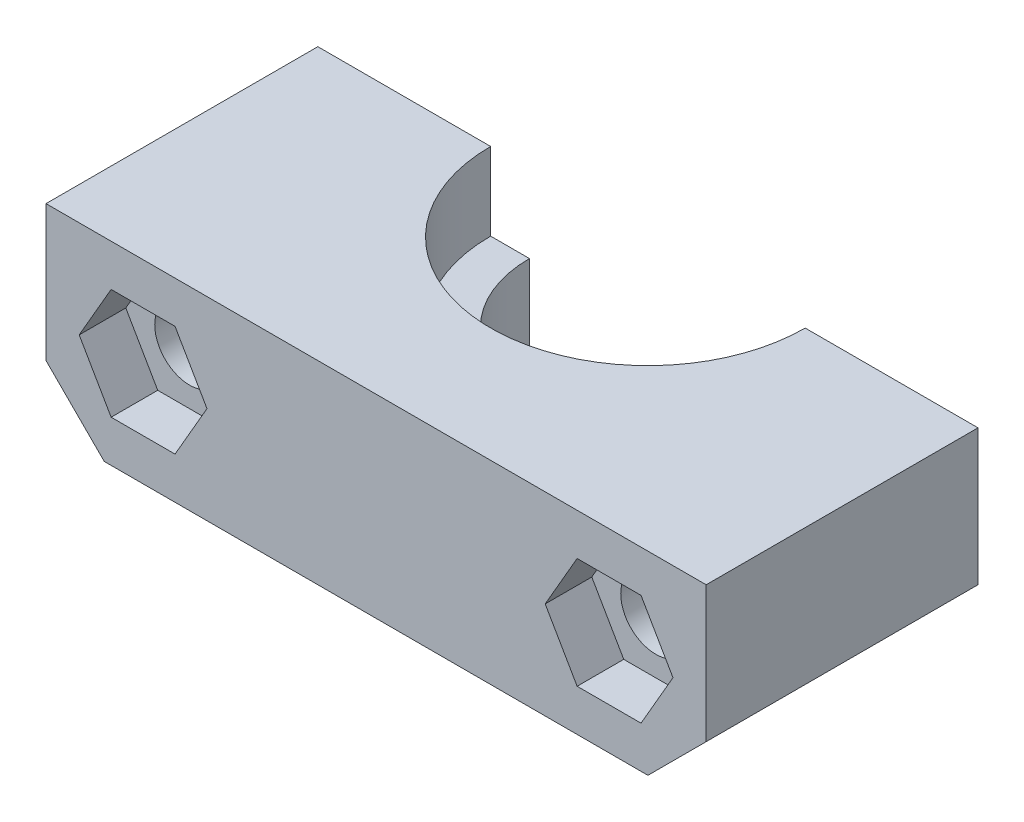
ISO-10303-21;
HEADER;
FILE_DESCRIPTION(('STEP AP214'),'2;1');
FILE_NAME('part.step','',(''),(''),'','','');
FILE_SCHEMA(('AUTOMOTIVE_DESIGN { 1 0 10303 214 1 1 1 1 }'));
ENDSEC;
DATA;
#1=APPLICATION_CONTEXT('core data for automotive mechanical design processes');
#2=APPLICATION_PROTOCOL_DEFINITION('international standard','automotive_design',2000,#1);
#3=PRODUCT_CONTEXT('',#1,'mechanical');
#4=PRODUCT('Part','Part','',(#3));
#5=PRODUCT_RELATED_PRODUCT_CATEGORY('part','',(#4));
#6=PRODUCT_DEFINITION_FORMATION('','',#4);
#7=PRODUCT_DEFINITION_CONTEXT('part definition',#1,'design');
#8=PRODUCT_DEFINITION('design','',#6,#7);
#9=PRODUCT_DEFINITION_SHAPE('','',#8);
#10=(LENGTH_UNIT() NAMED_UNIT(*) SI_UNIT(.MILLI.,.METRE.));
#11=(NAMED_UNIT(*) PLANE_ANGLE_UNIT() SI_UNIT($,.RADIAN.));
#12=(NAMED_UNIT(*) SI_UNIT($,.STERADIAN.) SOLID_ANGLE_UNIT());
#13=UNCERTAINTY_MEASURE_WITH_UNIT(LENGTH_MEASURE(1.E-05),#10,'distance_accuracy_value','');
#14=(GEOMETRIC_REPRESENTATION_CONTEXT(3) GLOBAL_UNCERTAINTY_ASSIGNED_CONTEXT((#13)) GLOBAL_UNIT_ASSIGNED_CONTEXT((#10,
#11,#12)) REPRESENTATION_CONTEXT('',''));
#15=CARTESIAN_POINT('',(0.,0.,0.));
#16=DIRECTION('',(0.,0.,1.));
#17=DIRECTION('',(1.,0.,0.));
#18=AXIS2_PLACEMENT_3D('',#15,#16,#17);
#19=CARTESIAN_POINT('',(29.,5.,0.));
#20=DIRECTION('',(0.,0.,-1.));
#21=DIRECTION('',(-1.,0.,0.));
#22=AXIS2_PLACEMENT_3D('',#19,#20,#21);
#23=CYLINDRICAL_SURFACE('',#22,1.8);
#24=CARTESIAN_POINT('',(29.,5.,-14.));
#25=DIRECTION('',(0.,0.,1.));
#26=DIRECTION('',(1.,0.,0.));
#27=AXIS2_PLACEMENT_3D('',#24,#25,#26);
#28=CIRCLE('',#27,1.8);
#29=CARTESIAN_POINT('',(27.2,5.,-14.));
#30=VERTEX_POINT('',#29);
#31=EDGE_CURVE('E291',#30,#30,#28,.T.);
#32=CARTESIAN_POINT('',(29.,5.,-2.4));
#33=DIRECTION('',(0.,0.,1.));
#34=DIRECTION('',(1.,0.,0.));
#35=AXIS2_PLACEMENT_3D('',#32,#33,#34);
#36=CIRCLE('',#35,1.8);
#37=CARTESIAN_POINT('',(27.2,5.,-2.4));
#38=VERTEX_POINT('',#37);
#39=EDGE_CURVE('E234',#38,#38,#36,.F.);
#40=CARTESIAN_POINT('',(27.2,5.,-14.));
#41=CARTESIAN_POINT('',(27.2,5.,-13.8791666666667));
#42=CARTESIAN_POINT('',(27.2,5.,-13.7583333333333));
#43=CARTESIAN_POINT('',(27.2,5.,-13.5166666666667));
#44=CARTESIAN_POINT('',(27.2,5.,-13.3958333333333));
#45=CARTESIAN_POINT('',(27.2,5.,-13.1541666666667));
#46=CARTESIAN_POINT('',(27.2,5.,-13.0333333333333));
#47=CARTESIAN_POINT('',(27.2,5.,-12.7916666666667));
#48=CARTESIAN_POINT('',(27.2,5.,-12.6708333333333));
#49=CARTESIAN_POINT('',(27.2,5.,-12.4291666666667));
#50=CARTESIAN_POINT('',(27.2,5.,-12.3083333333333));
#51=CARTESIAN_POINT('',(27.2,5.,-12.0666666666667));
#52=CARTESIAN_POINT('',(27.2,5.,-11.9458333333333));
#53=CARTESIAN_POINT('',(27.2,5.,-11.7041666666667));
#54=CARTESIAN_POINT('',(27.2,5.,-11.5833333333333));
#55=CARTESIAN_POINT('',(27.2,5.,-11.3416666666667));
#56=CARTESIAN_POINT('',(27.2,5.,-11.2208333333333));
#57=CARTESIAN_POINT('',(27.2,5.,-10.9791666666667));
#58=CARTESIAN_POINT('',(27.2,5.,-10.8583333333333));
#59=CARTESIAN_POINT('',(27.2,5.,-10.6166666666667));
#60=CARTESIAN_POINT('',(27.2,5.,-10.4958333333333));
#61=CARTESIAN_POINT('',(27.2,5.,-10.2541666666667));
#62=CARTESIAN_POINT('',(27.2,5.,-10.1333333333333));
#63=CARTESIAN_POINT('',(27.2,5.,-9.89166666666667));
#64=CARTESIAN_POINT('',(27.2,5.,-9.77083333333333));
#65=CARTESIAN_POINT('',(27.2,5.,-9.52916666666667));
#66=CARTESIAN_POINT('',(27.2,5.,-9.40833333333333));
#67=CARTESIAN_POINT('',(27.2,5.,-9.16666666666666));
#68=CARTESIAN_POINT('',(27.2,5.,-9.04583333333333));
#69=CARTESIAN_POINT('',(27.2,5.,-8.80416666666667));
#70=CARTESIAN_POINT('',(27.2,5.,-8.68333333333333));
#71=CARTESIAN_POINT('',(27.2,5.,-8.44166666666666));
#72=CARTESIAN_POINT('',(27.2,5.,-8.32083333333333));
#73=CARTESIAN_POINT('',(27.2,5.,-8.07916666666667));
#74=CARTESIAN_POINT('',(27.2,5.,-7.95833333333333));
#75=CARTESIAN_POINT('',(27.2,5.,-7.71666666666667));
#76=CARTESIAN_POINT('',(27.2,5.,-7.59583333333333));
#77=CARTESIAN_POINT('',(27.2,5.,-7.35416666666667));
#78=CARTESIAN_POINT('',(27.2,5.,-7.23333333333333));
#79=CARTESIAN_POINT('',(27.2,5.,-6.99166666666667));
#80=CARTESIAN_POINT('',(27.2,5.,-6.87083333333333));
#81=CARTESIAN_POINT('',(27.2,5.,-6.62916666666667));
#82=CARTESIAN_POINT('',(27.2,5.,-6.50833333333333));
#83=CARTESIAN_POINT('',(27.2,5.,-6.26666666666667));
#84=CARTESIAN_POINT('',(27.2,5.,-6.14583333333333));
#85=CARTESIAN_POINT('',(27.2,5.,-5.90416666666667));
#86=CARTESIAN_POINT('',(27.2,5.,-5.78333333333333));
#87=CARTESIAN_POINT('',(27.2,5.,-5.54166666666667));
#88=CARTESIAN_POINT('',(27.2,5.,-5.42083333333333));
#89=CARTESIAN_POINT('',(27.2,5.,-5.17916666666667));
#90=CARTESIAN_POINT('',(27.2,5.,-5.05833333333333));
#91=CARTESIAN_POINT('',(27.2,5.,-4.81666666666667));
#92=CARTESIAN_POINT('',(27.2,5.,-4.69583333333333));
#93=CARTESIAN_POINT('',(27.2,5.,-4.45416666666667));
#94=CARTESIAN_POINT('',(27.2,5.,-4.33333333333333));
#95=CARTESIAN_POINT('',(27.2,5.,-4.09166666666667));
#96=CARTESIAN_POINT('',(27.2,5.,-3.97083333333333));
#97=CARTESIAN_POINT('',(27.2,5.,-3.72916666666667));
#98=CARTESIAN_POINT('',(27.2,5.,-3.60833333333333));
#99=CARTESIAN_POINT('',(27.2,5.,-3.36666666666667));
#100=CARTESIAN_POINT('',(27.2,5.,-3.24583333333333));
#101=CARTESIAN_POINT('',(27.2,5.,-3.00416666666667));
#102=CARTESIAN_POINT('',(27.2,5.,-2.88333333333333));
#103=CARTESIAN_POINT('',(27.2,5.,-2.64166666666667));
#104=CARTESIAN_POINT('',(27.2,5.,-2.52083333333333));
#105=CARTESIAN_POINT('',(27.2,5.,-2.4));
#106=B_SPLINE_CURVE_WITH_KNOTS('',3,(#40,#41,#42,#43,#44,#45,#46,#47,#48,#49,#50,#51,#52,#53,
#54,#55,#56,#57,#58,#59,#60,#61,#62,#63,#64,#65,#66,#67,#68,#69,#70,#71,#72,#73,#74,#75,#76,#77,
#78,#79,#80,#81,#82,#83,#84,#85,#86,#87,#88,#89,#90,#91,#92,#93,#94,#95,#96,#97,#98,#99,#100,
#101,#102,#103,#104,#105),.UNSPECIFIED.,.F.,.F.,(4,2,2,2,2,2,2,2,2,2,2,2,2,2,2,2,2,2,2,2,2,2,2,
2,2,2,2,2,2,2,2,2,4),(0.,0.3625,0.725,1.0875,1.45,1.8125,2.175,2.5375,2.9,3.2625,3.625,3.9875,
4.35,4.7125,5.075,5.4375,5.8,6.1625,6.525,6.8875,7.25,7.6125,7.975,8.3375,8.7,9.0625,9.425,
9.7875,10.15,10.5125,10.875,11.2375,11.6),.UNSPECIFIED.);
#107=EDGE_CURVE('BSEAM32',#30,#38,#106,.T.);
#108=ORIENTED_EDGE('',*,*,#31,.F.);
#109=ORIENTED_EDGE('',*,*,#39,.F.);
#110=ORIENTED_EDGE('',*,*,#107,.T.);
#111=ORIENTED_EDGE('',*,*,#107,.F.);
#112=EDGE_LOOP('',(#108,#110,#109,#111));
#113=FACE_BOUND('',#112,.T.);
#114=ADVANCED_FACE('F32',(#113),#23,.F.);
#115=CARTESIAN_POINT('',(5.,5.,0.));
#116=DIRECTION('',(0.,0.,-1.));
#117=DIRECTION('',(-1.,0.,0.));
#118=AXIS2_PLACEMENT_3D('',#115,#116,#117);
#119=CYLINDRICAL_SURFACE('',#118,1.8);
#120=CARTESIAN_POINT('',(5.,5.,-14.));
#121=DIRECTION('',(0.,0.,1.));
#122=DIRECTION('',(1.,0.,0.));
#123=AXIS2_PLACEMENT_3D('',#120,#121,#122);
#124=CIRCLE('',#123,1.8);
#125=CARTESIAN_POINT('',(3.2,5.,-14.));
#126=VERTEX_POINT('',#125);
#127=EDGE_CURVE('E295',#126,#126,#124,.T.);
#128=CARTESIAN_POINT('',(5.,5.,-2.4));
#129=DIRECTION('',(0.,0.,1.));
#130=DIRECTION('',(1.,0.,0.));
#131=AXIS2_PLACEMENT_3D('',#128,#129,#130);
#132=CIRCLE('',#131,1.8);
#133=CARTESIAN_POINT('',(3.2,5.,-2.4));
#134=VERTEX_POINT('',#133);
#135=EDGE_CURVE('E280',#134,#134,#132,.F.);
#136=CARTESIAN_POINT('',(3.2,5.,-14.));
#137=CARTESIAN_POINT('',(3.2,5.,-13.8791666666667));
#138=CARTESIAN_POINT('',(3.2,5.,-13.7583333333333));
#139=CARTESIAN_POINT('',(3.2,5.,-13.5166666666667));
#140=CARTESIAN_POINT('',(3.2,5.,-13.3958333333333));
#141=CARTESIAN_POINT('',(3.2,5.,-13.1541666666667));
#142=CARTESIAN_POINT('',(3.2,5.,-13.0333333333333));
#143=CARTESIAN_POINT('',(3.2,5.,-12.7916666666667));
#144=CARTESIAN_POINT('',(3.2,5.,-12.6708333333333));
#145=CARTESIAN_POINT('',(3.2,5.,-12.4291666666667));
#146=CARTESIAN_POINT('',(3.2,5.,-12.3083333333333));
#147=CARTESIAN_POINT('',(3.2,5.,-12.0666666666667));
#148=CARTESIAN_POINT('',(3.2,5.,-11.9458333333333));
#149=CARTESIAN_POINT('',(3.2,5.,-11.7041666666667));
#150=CARTESIAN_POINT('',(3.2,5.,-11.5833333333333));
#151=CARTESIAN_POINT('',(3.2,5.,-11.3416666666667));
#152=CARTESIAN_POINT('',(3.2,5.,-11.2208333333333));
#153=CARTESIAN_POINT('',(3.2,5.,-10.9791666666667));
#154=CARTESIAN_POINT('',(3.2,5.,-10.8583333333333));
#155=CARTESIAN_POINT('',(3.2,5.,-10.6166666666667));
#156=CARTESIAN_POINT('',(3.2,5.,-10.4958333333333));
#157=CARTESIAN_POINT('',(3.2,5.,-10.2541666666667));
#158=CARTESIAN_POINT('',(3.2,5.,-10.1333333333333));
#159=CARTESIAN_POINT('',(3.2,5.,-9.89166666666667));
#160=CARTESIAN_POINT('',(3.2,5.,-9.77083333333333));
#161=CARTESIAN_POINT('',(3.2,5.,-9.52916666666667));
#162=CARTESIAN_POINT('',(3.2,5.,-9.40833333333333));
#163=CARTESIAN_POINT('',(3.2,5.,-9.16666666666666));
#164=CARTESIAN_POINT('',(3.2,5.,-9.04583333333333));
#165=CARTESIAN_POINT('',(3.2,5.,-8.80416666666667));
#166=CARTESIAN_POINT('',(3.2,5.,-8.68333333333333));
#167=CARTESIAN_POINT('',(3.2,5.,-8.44166666666666));
#168=CARTESIAN_POINT('',(3.2,5.,-8.32083333333333));
#169=CARTESIAN_POINT('',(3.2,5.,-8.07916666666667));
#170=CARTESIAN_POINT('',(3.2,5.,-7.95833333333333));
#171=CARTESIAN_POINT('',(3.2,5.,-7.71666666666667));
#172=CARTESIAN_POINT('',(3.2,5.,-7.59583333333333));
#173=CARTESIAN_POINT('',(3.2,5.,-7.35416666666667));
#174=CARTESIAN_POINT('',(3.2,5.,-7.23333333333333));
#175=CARTESIAN_POINT('',(3.2,5.,-6.99166666666667));
#176=CARTESIAN_POINT('',(3.2,5.,-6.87083333333333));
#177=CARTESIAN_POINT('',(3.2,5.,-6.62916666666667));
#178=CARTESIAN_POINT('',(3.2,5.,-6.50833333333333));
#179=CARTESIAN_POINT('',(3.2,5.,-6.26666666666667));
#180=CARTESIAN_POINT('',(3.2,5.,-6.14583333333333));
#181=CARTESIAN_POINT('',(3.2,5.,-5.90416666666667));
#182=CARTESIAN_POINT('',(3.2,5.,-5.78333333333333));
#183=CARTESIAN_POINT('',(3.2,5.,-5.54166666666667));
#184=CARTESIAN_POINT('',(3.2,5.,-5.42083333333333));
#185=CARTESIAN_POINT('',(3.2,5.,-5.17916666666667));
#186=CARTESIAN_POINT('',(3.2,5.,-5.05833333333333));
#187=CARTESIAN_POINT('',(3.2,5.,-4.81666666666667));
#188=CARTESIAN_POINT('',(3.2,5.,-4.69583333333333));
#189=CARTESIAN_POINT('',(3.2,5.,-4.45416666666667));
#190=CARTESIAN_POINT('',(3.2,5.,-4.33333333333333));
#191=CARTESIAN_POINT('',(3.2,5.,-4.09166666666667));
#192=CARTESIAN_POINT('',(3.2,5.,-3.97083333333333));
#193=CARTESIAN_POINT('',(3.2,5.,-3.72916666666667));
#194=CARTESIAN_POINT('',(3.2,5.,-3.60833333333333));
#195=CARTESIAN_POINT('',(3.2,5.,-3.36666666666667));
#196=CARTESIAN_POINT('',(3.2,5.,-3.24583333333333));
#197=CARTESIAN_POINT('',(3.2,5.,-3.00416666666667));
#198=CARTESIAN_POINT('',(3.2,5.,-2.88333333333333));
#199=CARTESIAN_POINT('',(3.2,5.,-2.64166666666667));
#200=CARTESIAN_POINT('',(3.2,5.,-2.52083333333333));
#201=CARTESIAN_POINT('',(3.2,5.,-2.4));
#202=B_SPLINE_CURVE_WITH_KNOTS('',3,(#136,#137,#138,#139,#140,#141,#142,#143,#144,#145,#146,
#147,#148,#149,#150,#151,#152,#153,#154,#155,#156,#157,#158,#159,#160,#161,#162,#163,#164,#165,
#166,#167,#168,#169,#170,#171,#172,#173,#174,#175,#176,#177,#178,#179,#180,#181,#182,#183,#184,
#185,#186,#187,#188,#189,#190,#191,#192,#193,#194,#195,#196,#197,#198,#199,#200,#201),
.UNSPECIFIED.,.F.,.F.,(4,2,2,2,2,2,2,2,2,2,2,2,2,2,2,2,2,2,2,2,2,2,2,2,2,2,2,2,2,2,2,2,4),(0.,
0.3625,0.725,1.0875,1.45,1.8125,2.175,2.5375,2.9,3.2625,3.625,3.9875,4.35,4.7125,5.075,5.4375,
5.8,6.1625,6.525,6.8875,7.25,7.6125,7.975,8.3375,8.7,9.0625,9.425,9.7875,10.15,10.5125,10.875,
11.2375,11.6),.UNSPECIFIED.);
#203=EDGE_CURVE('BSEAM411',#126,#134,#202,.T.);
#204=ORIENTED_EDGE('',*,*,#127,.F.);
#205=ORIENTED_EDGE('',*,*,#135,.F.);
#206=ORIENTED_EDGE('',*,*,#203,.T.);
#207=ORIENTED_EDGE('',*,*,#203,.F.);
#208=EDGE_LOOP('',(#204,#206,#205,#207));
#209=FACE_BOUND('',#208,.T.);
#210=ADVANCED_FACE('F411',(#209),#119,.F.);
#211=CARTESIAN_POINT('',(0.,10.,-14.));
#212=DIRECTION('',(0.,0.,1.));
#213=DIRECTION('',(1.,0.,0.));
#214=AXIS2_PLACEMENT_3D('',#211,#212,#213);
#215=PLANE('',#214);
#216=ORIENTED_EDGE('',*,*,#31,.T.);
#217=EDGE_LOOP('',(#216));
#218=FACE_BOUND('',#217,.T.);
#219=DIRECTION('',(0.,-1.,0.));
#220=VECTOR('',#219,1.);
#221=CARTESIAN_POINT('',(34.,10.,-14.));
#222=LINE('',#221,#220);
#223=CARTESIAN_POINT('',(34.,10.,-14.));
#224=VERTEX_POINT('',#223);
#225=CARTESIAN_POINT('',(34.,3.,-14.));
#226=VERTEX_POINT('',#225);
#227=EDGE_CURVE('E333',#224,#226,#222,.T.);
#228=ORIENTED_EDGE('',*,*,#227,.T.);
#229=DIRECTION('',(-0.707106781186548,-0.707106781186547,0.));
#230=VECTOR('',#229,1.);
#231=CARTESIAN_POINT('',(34.,3.,-14.));
#232=LINE('',#231,#230);
#233=CARTESIAN_POINT('',(31.,0.,-14.));
#234=VERTEX_POINT('',#233);
#235=EDGE_CURVE('E11',#226,#234,#232,.T.);
#236=ORIENTED_EDGE('',*,*,#235,.T.);
#237=DIRECTION('',(-1.,0.,0.));
#238=VECTOR('',#237,1.);
#239=CARTESIAN_POINT('',(0.,0.,-14.));
#240=LINE('',#239,#238);
#241=CARTESIAN_POINT('',(23.1,0.,-14.));
#242=VERTEX_POINT('',#241);
#243=EDGE_CURVE('E318',#234,#242,#240,.T.);
#244=ORIENTED_EDGE('',*,*,#243,.T.);
#245=DIRECTION('',(0.,1.,0.));
#246=VECTOR('',#245,1.);
#247=CARTESIAN_POINT('',(23.1,0.,-14.));
#248=LINE('',#247,#246);
#249=CARTESIAN_POINT('',(23.1,6.,-14.));
#250=VERTEX_POINT('',#249);
#251=EDGE_CURVE('E301',#242,#250,#248,.T.);
#252=ORIENTED_EDGE('',*,*,#251,.T.);
#253=DIRECTION('',(-1.,0.,0.));
#254=VECTOR('',#253,1.);
#255=CARTESIAN_POINT('',(0.,6.,-14.));
#256=LINE('',#255,#254);
#257=CARTESIAN_POINT('',(25.1,6.,-14.));
#258=VERTEX_POINT('',#257);
#259=EDGE_CURVE('E346',#258,#250,#256,.T.);
#260=ORIENTED_EDGE('',*,*,#259,.F.);
#261=DIRECTION('',(0.,1.,0.));
#262=VECTOR('',#261,1.);
#263=CARTESIAN_POINT('',(25.1,6.,-14.));
#264=LINE('',#263,#262);
#265=CARTESIAN_POINT('',(25.1,10.,-14.));
#266=VERTEX_POINT('',#265);
#267=EDGE_CURVE('E310',#258,#266,#264,.T.);
#268=ORIENTED_EDGE('',*,*,#267,.T.);
#269=DIRECTION('',(-1.,0.,0.));
#270=VECTOR('',#269,1.);
#271=CARTESIAN_POINT('',(0.,10.,-14.));
#272=LINE('',#271,#270);
#273=EDGE_CURVE('E323',#224,#266,#272,.T.);
#274=ORIENTED_EDGE('',*,*,#273,.F.);
#275=EDGE_LOOP('',(#228,#236,#244,#252,#260,#268,#274));
#276=FACE_BOUND('',#275,.T.);
#277=ADVANCED_FACE('F376',(#218,#276),#215,.F.);
#278=CARTESIAN_POINT('',(0.,10.,0.));
#279=DIRECTION('',(1.,0.,0.));
#280=DIRECTION('',(0.,0.,-1.));
#281=AXIS2_PLACEMENT_3D('',#278,#279,#280);
#282=PLANE('',#281);
#283=DIRECTION('',(0.,-1.,0.));
#284=VECTOR('',#283,1.);
#285=CARTESIAN_POINT('',(0.,10.,-14.));
#286=LINE('',#285,#284);
#287=CARTESIAN_POINT('',(0.,10.,-14.));
#288=VERTEX_POINT('',#287);
#289=CARTESIAN_POINT('',(0.,3.,-14.));
#290=VERTEX_POINT('',#289);
#291=EDGE_CURVE('E326',#288,#290,#286,.T.);
#292=ORIENTED_EDGE('',*,*,#291,.T.);
#293=DIRECTION('',(0.,0.,1.));
#294=VECTOR('',#293,1.);
#295=CARTESIAN_POINT('',(0.,3.,0.));
#296=LINE('',#295,#294);
#297=CARTESIAN_POINT('',(0.,3.,0.));
#298=VERTEX_POINT('',#297);
#299=EDGE_CURVE('E351',#290,#298,#296,.T.);
#300=ORIENTED_EDGE('',*,*,#299,.T.);
#301=DIRECTION('',(0.,-1.,0.));
#302=VECTOR('',#301,1.);
#303=CARTESIAN_POINT('',(0.,10.,0.));
#304=LINE('',#303,#302);
#305=CARTESIAN_POINT('',(0.,10.,0.));
#306=VERTEX_POINT('',#305);
#307=EDGE_CURVE('E339',#306,#298,#304,.T.);
#308=ORIENTED_EDGE('',*,*,#307,.F.);
#309=DIRECTION('',(0.,0.,1.));
#310=VECTOR('',#309,1.);
#311=CARTESIAN_POINT('',(0.,10.,0.));
#312=LINE('',#311,#310);
#313=EDGE_CURVE('E314',#288,#306,#312,.T.);
#314=ORIENTED_EDGE('',*,*,#313,.F.);
#315=EDGE_LOOP('',(#292,#300,#308,#314));
#316=FACE_BOUND('',#315,.T.);
#317=ADVANCED_FACE('F586',(#316),#282,.F.);
#318=CARTESIAN_POINT('',(0.,10.,0.));
#319=DIRECTION('',(0.,0.,-1.));
#320=DIRECTION('',(-1.,0.,0.));
#321=AXIS2_PLACEMENT_3D('',#318,#319,#320);
#322=PLANE('',#321);
#323=DIRECTION('',(0.5,-0.866025403784439,0.));
#324=VECTOR('',#323,1.);
#325=CARTESIAN_POINT('',(25.7091034656191,5.,0.));
#326=LINE('',#325,#324);
#327=CARTESIAN_POINT('',(25.7091034656191,5.,0.));
#328=VERTEX_POINT('',#327);
#329=CARTESIAN_POINT('',(27.3545517328096,2.15000000000001,0.));
#330=VERTEX_POINT('',#329);
#331=EDGE_CURVE('E222',#328,#330,#326,.T.);
#332=ORIENTED_EDGE('',*,*,#331,.F.);
#333=DIRECTION('',(-0.499999999999999,-0.866025403784439,0.));
#334=VECTOR('',#333,1.);
#335=CARTESIAN_POINT('',(27.3545517328096,7.85,0.));
#336=LINE('',#335,#334);
#337=CARTESIAN_POINT('',(27.3545517328096,7.85,0.));
#338=VERTEX_POINT('',#337);
#339=EDGE_CURVE('E189',#338,#328,#336,.T.);
#340=ORIENTED_EDGE('',*,*,#339,.F.);
#341=DIRECTION('',(-1.,0.,0.));
#342=VECTOR('',#341,1.);
#343=CARTESIAN_POINT('',(30.6454482671904,7.85,0.));
#344=LINE('',#343,#342);
#345=CARTESIAN_POINT('',(30.6454482671904,7.85,0.));
#346=VERTEX_POINT('',#345);
#347=EDGE_CURVE('E208',#346,#338,#344,.T.);
#348=ORIENTED_EDGE('',*,*,#347,.F.);
#349=DIRECTION('',(-0.499999999999999,0.866025403784439,0.));
#350=VECTOR('',#349,1.);
#351=CARTESIAN_POINT('',(32.2908965343809,5.,0.));
#352=LINE('',#351,#350);
#353=CARTESIAN_POINT('',(32.2908965343809,5.,0.));
#354=VERTEX_POINT('',#353);
#355=EDGE_CURVE('E211',#354,#346,#352,.T.);
#356=ORIENTED_EDGE('',*,*,#355,.F.);
#357=DIRECTION('',(0.5,0.866025403784439,0.));
#358=VECTOR('',#357,1.);
#359=CARTESIAN_POINT('',(30.6454482671904,2.15000000000001,0.));
#360=LINE('',#359,#358);
#361=CARTESIAN_POINT('',(30.6454482671904,2.15000000000001,0.));
#362=VERTEX_POINT('',#361);
#363=EDGE_CURVE('E227',#362,#354,#360,.T.);
#364=ORIENTED_EDGE('',*,*,#363,.F.);
#365=DIRECTION('',(1.,0.,0.));
#366=VECTOR('',#365,1.);
#367=CARTESIAN_POINT('',(27.3545517328096,2.15000000000001,0.));
#368=LINE('',#367,#366);
#369=EDGE_CURVE('E224',#330,#362,#368,.T.);
#370=ORIENTED_EDGE('',*,*,#369,.F.);
#371=EDGE_LOOP('',(#332,#340,#348,#356,#364,#370));
#372=FACE_BOUND('',#371,.T.);
#373=DIRECTION('',(-0.5,0.866025403784439,0.));
#374=VECTOR('',#373,1.);
#375=CARTESIAN_POINT('',(8.29089653438087,5.,0.));
#376=LINE('',#375,#374);
#377=CARTESIAN_POINT('',(8.29089653438087,5.,0.));
#378=VERTEX_POINT('',#377);
#379=CARTESIAN_POINT('',(6.64544826719044,7.85000000000001,0.));
#380=VERTEX_POINT('',#379);
#381=EDGE_CURVE('E264',#378,#380,#376,.T.);
#382=ORIENTED_EDGE('',*,*,#381,.F.);
#383=DIRECTION('',(0.5,0.866025403784439,0.));
#384=VECTOR('',#383,1.);
#385=CARTESIAN_POINT('',(6.64544826719044,2.15,0.));
#386=LINE('',#385,#384);
#387=CARTESIAN_POINT('',(6.64544826719044,2.15,0.));
#388=VERTEX_POINT('',#387);
#389=EDGE_CURVE('E262',#388,#378,#386,.T.);
#390=ORIENTED_EDGE('',*,*,#389,.F.);
#391=DIRECTION('',(1.,0.,0.));
#392=VECTOR('',#391,1.);
#393=CARTESIAN_POINT('',(3.35455173280957,2.15,0.));
#394=LINE('',#393,#392);
#395=CARTESIAN_POINT('',(3.35455173280957,2.15,0.));
#396=VERTEX_POINT('',#395);
#397=EDGE_CURVE('E246',#396,#388,#394,.T.);
#398=ORIENTED_EDGE('',*,*,#397,.F.);
#399=DIRECTION('',(0.5,-0.866025403784439,0.));
#400=VECTOR('',#399,1.);
#401=CARTESIAN_POINT('',(1.70910346561913,5.00000000000001,0.));
#402=LINE('',#401,#400);
#403=CARTESIAN_POINT('',(1.70910346561913,5.00000000000001,0.));
#404=VERTEX_POINT('',#403);
#405=EDGE_CURVE('E273',#404,#396,#402,.T.);
#406=ORIENTED_EDGE('',*,*,#405,.F.);
#407=DIRECTION('',(-0.5,-0.866025403784439,0.));
#408=VECTOR('',#407,1.);
#409=CARTESIAN_POINT('',(3.35455173280957,7.85,0.));
#410=LINE('',#409,#408);
#411=CARTESIAN_POINT('',(3.35455173280957,7.85,0.));
#412=VERTEX_POINT('',#411);
#413=EDGE_CURVE('E270',#412,#404,#410,.T.);
#414=ORIENTED_EDGE('',*,*,#413,.F.);
#415=DIRECTION('',(-1.,0.,0.));
#416=VECTOR('',#415,1.);
#417=CARTESIAN_POINT('',(6.64544826719044,7.85000000000001,0.));
#418=LINE('',#417,#416);
#419=EDGE_CURVE('E267',#380,#412,#418,.T.);
#420=ORIENTED_EDGE('',*,*,#419,.F.);
#421=EDGE_LOOP('',(#382,#390,#398,#406,#414,#420));
#422=FACE_BOUND('',#421,.T.);
#423=ORIENTED_EDGE('',*,*,#307,.T.);
#424=DIRECTION('',(0.707106781186548,-0.707106781186547,0.));
#425=VECTOR('',#424,1.);
#426=CARTESIAN_POINT('',(0.,3.,0.));
#427=LINE('',#426,#425);
#428=CARTESIAN_POINT('',(3.00000000000001,0.,0.));
#429=VERTEX_POINT('',#428);
#430=EDGE_CURVE('E362',#298,#429,#427,.T.);
#431=ORIENTED_EDGE('',*,*,#430,.T.);
#432=DIRECTION('',(1.,0.,0.));
#433=VECTOR('',#432,1.);
#434=CARTESIAN_POINT('',(0.,0.,0.));
#435=LINE('',#434,#433);
#436=CARTESIAN_POINT('',(31.,0.,0.));
#437=VERTEX_POINT('',#436);
#438=EDGE_CURVE('E313',#429,#437,#435,.T.);
#439=ORIENTED_EDGE('',*,*,#438,.T.);
#440=DIRECTION('',(0.707106781186548,0.707106781186547,0.));
#441=VECTOR('',#440,1.);
#442=CARTESIAN_POINT('',(34.,3.,0.));
#443=LINE('',#442,#441);
#444=CARTESIAN_POINT('',(34.,3.,0.));
#445=VERTEX_POINT('',#444);
#446=EDGE_CURVE('E360',#437,#445,#443,.T.);
#447=ORIENTED_EDGE('',*,*,#446,.T.);
#448=DIRECTION('',(0.,-1.,0.));
#449=VECTOR('',#448,1.);
#450=CARTESIAN_POINT('',(34.,10.,0.));
#451=LINE('',#450,#449);
#452=CARTESIAN_POINT('',(34.,10.,0.));
#453=VERTEX_POINT('',#452);
#454=EDGE_CURVE('E336',#453,#445,#451,.T.);
#455=ORIENTED_EDGE('',*,*,#454,.F.);
#456=DIRECTION('',(1.,0.,0.));
#457=VECTOR('',#456,1.);
#458=CARTESIAN_POINT('',(0.,10.,0.));
#459=LINE('',#458,#457);
#460=EDGE_CURVE('E317',#306,#453,#459,.T.);
#461=ORIENTED_EDGE('',*,*,#460,.F.);
#462=EDGE_LOOP('',(#423,#431,#439,#447,#455,#461));
#463=FACE_BOUND('',#462,.T.);
#464=ADVANCED_FACE('F385',(#372,#422,#463),#322,.F.);
#465=CARTESIAN_POINT('',(34.,10.,0.));
#466=DIRECTION('',(-1.,0.,0.));
#467=DIRECTION('',(0.,0.,1.));
#468=AXIS2_PLACEMENT_3D('',#465,#466,#467);
#469=PLANE('',#468);
#470=ORIENTED_EDGE('',*,*,#454,.T.);
#471=DIRECTION('',(0.,0.,-1.));
#472=VECTOR('',#471,1.);
#473=CARTESIAN_POINT('',(34.,3.,-14.));
#474=LINE('',#473,#472);
#475=EDGE_CURVE('E40',#445,#226,#474,.T.);
#476=ORIENTED_EDGE('',*,*,#475,.T.);
#477=ORIENTED_EDGE('',*,*,#227,.F.);
#478=DIRECTION('',(0.,0.,-1.));
#479=VECTOR('',#478,1.);
#480=CARTESIAN_POINT('',(34.,10.,0.));
#481=LINE('',#480,#479);
#482=EDGE_CURVE('E320',#453,#224,#481,.T.);
#483=ORIENTED_EDGE('',*,*,#482,.F.);
#484=EDGE_LOOP('',(#470,#476,#477,#483));
#485=FACE_BOUND('',#484,.T.);
#486=ADVANCED_FACE('F370',(#485),#469,.F.);
#487=ORIENTED_EDGE('',*,*,#127,.T.);
#488=EDGE_LOOP('',(#487));
#489=FACE_BOUND('',#488,.T.);
#490=CARTESIAN_POINT('',(10.9,0.,-14.));
#491=VERTEX_POINT('',#490);
#492=CARTESIAN_POINT('',(3.00000000000001,0.,-14.));
#493=VERTEX_POINT('',#492);
#494=EDGE_CURVE('E329',#491,#493,#240,.T.);
#495=ORIENTED_EDGE('',*,*,#494,.T.);
#496=DIRECTION('',(-0.707106781186548,0.707106781186547,0.));
#497=VECTOR('',#496,1.);
#498=CARTESIAN_POINT('',(0.,3.,-14.));
#499=LINE('',#498,#497);
#500=EDGE_CURVE('E367',#493,#290,#499,.T.);
#501=ORIENTED_EDGE('',*,*,#500,.T.);
#502=ORIENTED_EDGE('',*,*,#291,.F.);
#503=CARTESIAN_POINT('',(8.9,10.,-14.));
#504=VERTEX_POINT('',#503);
#505=EDGE_CURVE('E322',#504,#288,#272,.T.);
#506=ORIENTED_EDGE('',*,*,#505,.F.);
#507=DIRECTION('',(0.,1.,0.));
#508=VECTOR('',#507,1.);
#509=CARTESIAN_POINT('',(8.9,6.,-14.));
#510=LINE('',#509,#508);
#511=CARTESIAN_POINT('',(8.9,6.,-14.));
#512=VERTEX_POINT('',#511);
#513=EDGE_CURVE('E307',#504,#512,#510,.F.);
#514=ORIENTED_EDGE('',*,*,#513,.T.);
#515=CARTESIAN_POINT('',(10.9,6.,-14.));
#516=VERTEX_POINT('',#515);
#517=EDGE_CURVE('E345',#516,#512,#256,.T.);
#518=ORIENTED_EDGE('',*,*,#517,.F.);
#519=DIRECTION('',(0.,1.,0.));
#520=VECTOR('',#519,1.);
#521=CARTESIAN_POINT('',(10.9,0.,-14.));
#522=LINE('',#521,#520);
#523=EDGE_CURVE('E298',#516,#491,#522,.F.);
#524=ORIENTED_EDGE('',*,*,#523,.T.);
#525=EDGE_LOOP('',(#495,#501,#502,#506,#514,#518,#524));
#526=FACE_BOUND('',#525,.T.);
#527=ADVANCED_FACE('F396',(#489,#526),#215,.F.);
#528=CARTESIAN_POINT('',(0.,10.,0.));
#529=DIRECTION('',(0.,-1.,0.));
#530=DIRECTION('',(0.,0.,-1.));
#531=AXIS2_PLACEMENT_3D('',#528,#529,#530);
#532=PLANE('',#531);
#533=ORIENTED_EDGE('',*,*,#273,.T.);
#534=CARTESIAN_POINT('',(17.,10.,-14.));
#535=DIRECTION('',(0.,-1.,0.));
#536=DIRECTION('',(0.,0.,-1.));
#537=AXIS2_PLACEMENT_3D('',#534,#535,#536);
#538=CIRCLE('',#537,8.1);
#539=EDGE_CURVE('E342',#266,#504,#538,.T.);
#540=ORIENTED_EDGE('',*,*,#539,.T.);
#541=ORIENTED_EDGE('',*,*,#505,.T.);
#542=ORIENTED_EDGE('',*,*,#313,.T.);
#543=ORIENTED_EDGE('',*,*,#460,.T.);
#544=ORIENTED_EDGE('',*,*,#482,.T.);
#545=EDGE_LOOP('',(#533,#540,#541,#542,#543,#544));
#546=FACE_BOUND('',#545,.T.);
#547=ADVANCED_FACE('F380',(#546),#532,.F.);
#548=CARTESIAN_POINT('',(0.,0.,0.));
#549=DIRECTION('',(0.,-1.,0.));
#550=DIRECTION('',(0.,0.,-1.));
#551=AXIS2_PLACEMENT_3D('',#548,#549,#550);
#552=PLANE('',#551);
#553=ORIENTED_EDGE('',*,*,#438,.F.);
#554=DIRECTION('',(0.,0.,-1.));
#555=VECTOR('',#554,1.);
#556=CARTESIAN_POINT('',(3.00000000000001,0.,-14.));
#557=LINE('',#556,#555);
#558=EDGE_CURVE('E53',#429,#493,#557,.T.);
#559=ORIENTED_EDGE('',*,*,#558,.T.);
#560=ORIENTED_EDGE('',*,*,#494,.F.);
#561=CARTESIAN_POINT('',(17.,0.,-14.));
#562=DIRECTION('',(0.,1.,0.));
#563=DIRECTION('',(0.,0.,1.));
#564=AXIS2_PLACEMENT_3D('',#561,#562,#563);
#565=CIRCLE('',#564,6.1);
#566=EDGE_CURVE('E294',#491,#242,#565,.T.);
#567=ORIENTED_EDGE('',*,*,#566,.T.);
#568=ORIENTED_EDGE('',*,*,#243,.F.);
#569=DIRECTION('',(0.,0.,1.));
#570=VECTOR('',#569,1.);
#571=CARTESIAN_POINT('',(31.,0.,0.));
#572=LINE('',#571,#570);
#573=EDGE_CURVE('E364',#234,#437,#572,.T.);
#574=ORIENTED_EDGE('',*,*,#573,.T.);
#575=EDGE_LOOP('',(#553,#559,#560,#567,#568,#574));
#576=FACE_BOUND('',#575,.T.);
#577=ADVANCED_FACE('F386',(#576),#552,.T.);
#578=CARTESIAN_POINT('',(17.,6.,-14.));
#579=DIRECTION('',(0.,1.,0.));
#580=DIRECTION('',(0.,0.,1.));
#581=AXIS2_PLACEMENT_3D('',#578,#579,#580);
#582=PLANE('',#581);
#583=CARTESIAN_POINT('',(17.,6.,-14.));
#584=DIRECTION('',(0.,1.,0.));
#585=DIRECTION('',(0.,0.,1.));
#586=AXIS2_PLACEMENT_3D('',#583,#584,#585);
#587=CIRCLE('',#586,6.1);
#588=EDGE_CURVE('E349',#516,#250,#587,.T.);
#589=ORIENTED_EDGE('',*,*,#588,.F.);
#590=ORIENTED_EDGE('',*,*,#517,.T.);
#591=CARTESIAN_POINT('',(17.,6.,-14.));
#592=DIRECTION('',(0.,1.,0.));
#593=DIRECTION('',(0.,0.,1.));
#594=AXIS2_PLACEMENT_3D('',#591,#592,#593);
#595=CIRCLE('',#594,8.1);
#596=EDGE_CURVE('E304',#512,#258,#595,.T.);
#597=ORIENTED_EDGE('',*,*,#596,.T.);
#598=ORIENTED_EDGE('',*,*,#259,.T.);
#599=EDGE_LOOP('',(#589,#590,#597,#598));
#600=FACE_BOUND('',#599,.T.);
#601=ADVANCED_FACE('F393',(#600),#582,.T.);
#602=CARTESIAN_POINT('',(17.,6.,-14.));
#603=DIRECTION('',(0.,1.,0.));
#604=DIRECTION('',(0.,0.,1.));
#605=AXIS2_PLACEMENT_3D('',#602,#603,#604);
#606=CYLINDRICAL_SURFACE('',#605,8.1);
#607=ORIENTED_EDGE('',*,*,#596,.F.);
#608=ORIENTED_EDGE('',*,*,#513,.F.);
#609=ORIENTED_EDGE('',*,*,#539,.F.);
#610=ORIENTED_EDGE('',*,*,#267,.F.);
#611=EDGE_LOOP('',(#607,#608,#609,#610));
#612=FACE_BOUND('',#611,.T.);
#613=ADVANCED_FACE('F399',(#612),#606,.F.);
#614=CARTESIAN_POINT('',(17.,0.,-14.));
#615=DIRECTION('',(0.,1.,0.));
#616=DIRECTION('',(0.,0.,1.));
#617=AXIS2_PLACEMENT_3D('',#614,#615,#616);
#618=CYLINDRICAL_SURFACE('',#617,6.1);
#619=ORIENTED_EDGE('',*,*,#566,.F.);
#620=ORIENTED_EDGE('',*,*,#523,.F.);
#621=ORIENTED_EDGE('',*,*,#588,.T.);
#622=ORIENTED_EDGE('',*,*,#251,.F.);
#623=EDGE_LOOP('',(#619,#620,#621,#622));
#624=FACE_BOUND('',#623,.T.);
#625=ADVANCED_FACE('F389',(#624),#618,.F.);
#626=CARTESIAN_POINT('',(0.,0.,-2.4));
#627=DIRECTION('',(0.,0.,1.));
#628=DIRECTION('',(1.,0.,0.));
#629=AXIS2_PLACEMENT_3D('',#626,#627,#628);
#630=PLANE('',#629);
#631=DIRECTION('',(0.5,0.866025403784439,0.));
#632=VECTOR('',#631,1.);
#633=CARTESIAN_POINT('',(6.64544826719044,2.15,-2.4));
#634=LINE('',#633,#632);
#635=CARTESIAN_POINT('',(6.64544826719044,2.15,-2.4));
#636=VERTEX_POINT('',#635);
#637=CARTESIAN_POINT('',(8.29089653438087,5.,-2.4));
#638=VERTEX_POINT('',#637);
#639=EDGE_CURVE('E242',#636,#638,#634,.T.);
#640=ORIENTED_EDGE('',*,*,#639,.T.);
#641=DIRECTION('',(-0.5,0.866025403784439,0.));
#642=VECTOR('',#641,1.);
#643=CARTESIAN_POINT('',(8.29089653438087,5.,-2.4));
#644=LINE('',#643,#642);
#645=CARTESIAN_POINT('',(6.64544826719044,7.85000000000001,-2.4));
#646=VERTEX_POINT('',#645);
#647=EDGE_CURVE('E245',#638,#646,#644,.T.);
#648=ORIENTED_EDGE('',*,*,#647,.T.);
#649=DIRECTION('',(-1.,0.,0.));
#650=VECTOR('',#649,1.);
#651=CARTESIAN_POINT('',(6.64544826719044,7.85000000000001,-2.4));
#652=LINE('',#651,#650);
#653=CARTESIAN_POINT('',(3.35455173280957,7.85,-2.4));
#654=VERTEX_POINT('',#653);
#655=EDGE_CURVE('E249',#646,#654,#652,.T.);
#656=ORIENTED_EDGE('',*,*,#655,.T.);
#657=DIRECTION('',(-0.5,-0.866025403784439,0.));
#658=VECTOR('',#657,1.);
#659=CARTESIAN_POINT('',(3.35455173280957,7.85,-2.4));
#660=LINE('',#659,#658);
#661=CARTESIAN_POINT('',(1.70910346561913,5.00000000000001,-2.4));
#662=VERTEX_POINT('',#661);
#663=EDGE_CURVE('E252',#654,#662,#660,.T.);
#664=ORIENTED_EDGE('',*,*,#663,.T.);
#665=DIRECTION('',(0.5,-0.866025403784439,0.));
#666=VECTOR('',#665,1.);
#667=CARTESIAN_POINT('',(1.70910346561913,5.00000000000001,-2.4));
#668=LINE('',#667,#666);
#669=CARTESIAN_POINT('',(3.35455173280957,2.15,-2.4));
#670=VERTEX_POINT('',#669);
#671=EDGE_CURVE('E255',#662,#670,#668,.T.);
#672=ORIENTED_EDGE('',*,*,#671,.T.);
#673=DIRECTION('',(1.,0.,0.));
#674=VECTOR('',#673,1.);
#675=CARTESIAN_POINT('',(3.35455173280957,2.15,-2.4));
#676=LINE('',#675,#674);
#677=EDGE_CURVE('E258',#670,#636,#676,.T.);
#678=ORIENTED_EDGE('',*,*,#677,.T.);
#679=EDGE_LOOP('',(#640,#648,#656,#664,#672,#678));
#680=FACE_BOUND('',#679,.T.);
#681=ORIENTED_EDGE('',*,*,#135,.T.);
#682=EDGE_LOOP('',(#681));
#683=FACE_BOUND('',#682,.T.);
#684=ADVANCED_FACE('F406',(#680,#683),#630,.T.);
#685=CARTESIAN_POINT('',(6.64544826719044,2.15,-2.4));
#686=DIRECTION('',(0.866025403784439,-0.5,0.));
#687=DIRECTION('',(0.5,0.866025403784439,0.));
#688=AXIS2_PLACEMENT_3D('',#685,#686,#687);
#689=PLANE('',#688);
#690=ORIENTED_EDGE('',*,*,#389,.T.);
#691=DIRECTION('',(0.,0.,1.));
#692=VECTOR('',#691,1.);
#693=CARTESIAN_POINT('',(8.29089653438087,5.,-2.4));
#694=LINE('',#693,#692);
#695=EDGE_CURVE('E261',#638,#378,#694,.T.);
#696=ORIENTED_EDGE('',*,*,#695,.F.);
#697=ORIENTED_EDGE('',*,*,#639,.F.);
#698=DIRECTION('',(0.,0.,1.));
#699=VECTOR('',#698,1.);
#700=CARTESIAN_POINT('',(6.64544826719044,2.15,-2.4));
#701=LINE('',#700,#699);
#702=EDGE_CURVE('E278',#636,#388,#701,.T.);
#703=ORIENTED_EDGE('',*,*,#702,.T.);
#704=EDGE_LOOP('',(#690,#696,#697,#703));
#705=FACE_BOUND('',#704,.T.);
#706=ADVANCED_FACE('F422',(#705),#689,.F.);
#707=CARTESIAN_POINT('',(3.35455173280957,2.15,-2.4));
#708=DIRECTION('',(0.,-1.,0.));
#709=DIRECTION('',(1.,0.,0.));
#710=AXIS2_PLACEMENT_3D('',#707,#708,#709);
#711=PLANE('',#710);
#712=ORIENTED_EDGE('',*,*,#397,.T.);
#713=ORIENTED_EDGE('',*,*,#702,.F.);
#714=ORIENTED_EDGE('',*,*,#677,.F.);
#715=DIRECTION('',(0.,0.,1.));
#716=VECTOR('',#715,1.);
#717=CARTESIAN_POINT('',(3.35455173280957,2.15,-2.4));
#718=LINE('',#717,#716);
#719=EDGE_CURVE('E281',#670,#396,#718,.T.);
#720=ORIENTED_EDGE('',*,*,#719,.T.);
#721=EDGE_LOOP('',(#712,#713,#714,#720));
#722=FACE_BOUND('',#721,.T.);
#723=ADVANCED_FACE('F425',(#722),#711,.F.);
#724=CARTESIAN_POINT('',(1.70910346561913,5.00000000000001,-2.4));
#725=DIRECTION('',(-0.866025403784439,-0.5,0.));
#726=DIRECTION('',(0.5,-0.866025403784439,0.));
#727=AXIS2_PLACEMENT_3D('',#724,#725,#726);
#728=PLANE('',#727);
#729=ORIENTED_EDGE('',*,*,#405,.T.);
#730=ORIENTED_EDGE('',*,*,#719,.F.);
#731=ORIENTED_EDGE('',*,*,#671,.F.);
#732=DIRECTION('',(0.,0.,1.));
#733=VECTOR('',#732,1.);
#734=CARTESIAN_POINT('',(1.70910346561913,5.00000000000001,-2.4));
#735=LINE('',#734,#733);
#736=EDGE_CURVE('E283',#662,#404,#735,.T.);
#737=ORIENTED_EDGE('',*,*,#736,.T.);
#738=EDGE_LOOP('',(#729,#730,#731,#737));
#739=FACE_BOUND('',#738,.T.);
#740=ADVANCED_FACE('F438',(#739),#728,.F.);
#741=CARTESIAN_POINT('',(3.35455173280957,7.85,-2.4));
#742=DIRECTION('',(-0.866025403784439,0.5,0.));
#743=DIRECTION('',(-0.5,-0.866025403784439,0.));
#744=AXIS2_PLACEMENT_3D('',#741,#742,#743);
#745=PLANE('',#744);
#746=ORIENTED_EDGE('',*,*,#413,.T.);
#747=ORIENTED_EDGE('',*,*,#736,.F.);
#748=ORIENTED_EDGE('',*,*,#663,.F.);
#749=DIRECTION('',(0.,0.,1.));
#750=VECTOR('',#749,1.);
#751=CARTESIAN_POINT('',(3.35455173280957,7.85,-2.4));
#752=LINE('',#751,#750);
#753=EDGE_CURVE('E285',#654,#412,#752,.T.);
#754=ORIENTED_EDGE('',*,*,#753,.T.);
#755=EDGE_LOOP('',(#746,#747,#748,#754));
#756=FACE_BOUND('',#755,.T.);
#757=ADVANCED_FACE('F434',(#756),#745,.F.);
#758=CARTESIAN_POINT('',(6.64544826719044,7.85000000000001,-2.4));
#759=DIRECTION('',(0.,1.,0.));
#760=DIRECTION('',(-1.,0.,0.));
#761=AXIS2_PLACEMENT_3D('',#758,#759,#760);
#762=PLANE('',#761);
#763=ORIENTED_EDGE('',*,*,#419,.T.);
#764=ORIENTED_EDGE('',*,*,#753,.F.);
#765=ORIENTED_EDGE('',*,*,#655,.F.);
#766=DIRECTION('',(0.,0.,1.));
#767=VECTOR('',#766,1.);
#768=CARTESIAN_POINT('',(6.64544826719044,7.85000000000001,-2.4));
#769=LINE('',#768,#767);
#770=EDGE_CURVE('E287',#646,#380,#769,.T.);
#771=ORIENTED_EDGE('',*,*,#770,.T.);
#772=EDGE_LOOP('',(#763,#764,#765,#771));
#773=FACE_BOUND('',#772,.T.);
#774=ADVANCED_FACE('F430',(#773),#762,.F.);
#775=CARTESIAN_POINT('',(8.29089653438087,5.,-2.4));
#776=DIRECTION('',(0.866025403784439,0.5,0.));
#777=DIRECTION('',(-0.5,0.866025403784439,0.));
#778=AXIS2_PLACEMENT_3D('',#775,#776,#777);
#779=PLANE('',#778);
#780=ORIENTED_EDGE('',*,*,#381,.T.);
#781=ORIENTED_EDGE('',*,*,#770,.F.);
#782=ORIENTED_EDGE('',*,*,#647,.F.);
#783=ORIENTED_EDGE('',*,*,#695,.T.);
#784=EDGE_LOOP('',(#780,#781,#782,#783));
#785=FACE_BOUND('',#784,.T.);
#786=ADVANCED_FACE('F427',(#785),#779,.F.);
#787=CARTESIAN_POINT('',(0.,0.,-2.4));
#788=DIRECTION('',(0.,0.,1.));
#789=DIRECTION('',(1.,0.,0.));
#790=AXIS2_PLACEMENT_3D('',#787,#788,#789);
#791=PLANE('',#790);
#792=DIRECTION('',(-0.499999999999999,-0.866025403784439,0.));
#793=VECTOR('',#792,1.);
#794=CARTESIAN_POINT('',(27.3545517328096,7.85,-2.4));
#795=LINE('',#794,#793);
#796=CARTESIAN_POINT('',(27.3545517328096,7.85,-2.4));
#797=VERTEX_POINT('',#796);
#798=CARTESIAN_POINT('',(25.7091034656191,5.,-2.4));
#799=VERTEX_POINT('',#798);
#800=EDGE_CURVE('E186',#797,#799,#795,.T.);
#801=ORIENTED_EDGE('',*,*,#800,.T.);
#802=DIRECTION('',(0.5,-0.866025403784439,0.));
#803=VECTOR('',#802,1.);
#804=CARTESIAN_POINT('',(25.7091034656191,5.,-2.4));
#805=LINE('',#804,#803);
#806=CARTESIAN_POINT('',(27.3545517328096,2.15000000000001,-2.4));
#807=VERTEX_POINT('',#806);
#808=EDGE_CURVE('E197',#799,#807,#805,.T.);
#809=ORIENTED_EDGE('',*,*,#808,.T.);
#810=DIRECTION('',(1.,0.,0.));
#811=VECTOR('',#810,1.);
#812=CARTESIAN_POINT('',(27.3545517328096,2.15000000000001,-2.4));
#813=LINE('',#812,#811);
#814=CARTESIAN_POINT('',(30.6454482671904,2.15000000000001,-2.4));
#815=VERTEX_POINT('',#814);
#816=EDGE_CURVE('E202',#807,#815,#813,.T.);
#817=ORIENTED_EDGE('',*,*,#816,.T.);
#818=DIRECTION('',(0.5,0.866025403784439,0.));
#819=VECTOR('',#818,1.);
#820=CARTESIAN_POINT('',(30.6454482671904,2.15000000000001,-2.4));
#821=LINE('',#820,#819);
#822=CARTESIAN_POINT('',(32.2908965343809,5.,-2.4));
#823=VERTEX_POINT('',#822);
#824=EDGE_CURVE('E215',#815,#823,#821,.T.);
#825=ORIENTED_EDGE('',*,*,#824,.T.);
#826=DIRECTION('',(-0.499999999999999,0.866025403784439,0.));
#827=VECTOR('',#826,1.);
#828=CARTESIAN_POINT('',(32.2908965343809,5.,-2.4));
#829=LINE('',#828,#827);
#830=CARTESIAN_POINT('',(30.6454482671904,7.85,-2.4));
#831=VERTEX_POINT('',#830);
#832=EDGE_CURVE('E218',#823,#831,#829,.T.);
#833=ORIENTED_EDGE('',*,*,#832,.T.);
#834=DIRECTION('',(-1.,0.,0.));
#835=VECTOR('',#834,1.);
#836=CARTESIAN_POINT('',(30.6454482671904,7.85,-2.4));
#837=LINE('',#836,#835);
#838=EDGE_CURVE('E194',#831,#797,#837,.T.);
#839=ORIENTED_EDGE('',*,*,#838,.T.);
#840=EDGE_LOOP('',(#801,#809,#817,#825,#833,#839));
#841=FACE_BOUND('',#840,.T.);
#842=ORIENTED_EDGE('',*,*,#39,.T.);
#843=EDGE_LOOP('',(#842));
#844=FACE_BOUND('',#843,.T.);
#845=ADVANCED_FACE('F204',(#841,#844),#791,.T.);
#846=CARTESIAN_POINT('',(27.3545517328096,7.85,-2.4));
#847=DIRECTION('',(-0.866025403784439,0.499999999999999,0.));
#848=DIRECTION('',(-0.499999999999999,-0.866025403784439,0.));
#849=AXIS2_PLACEMENT_3D('',#846,#847,#848);
#850=PLANE('',#849);
#851=ORIENTED_EDGE('',*,*,#339,.T.);
#852=DIRECTION('',(0.,0.,1.));
#853=VECTOR('',#852,1.);
#854=CARTESIAN_POINT('',(25.7091034656191,5.,-2.4));
#855=LINE('',#854,#853);
#856=EDGE_CURVE('E182',#799,#328,#855,.T.);
#857=ORIENTED_EDGE('',*,*,#856,.F.);
#858=ORIENTED_EDGE('',*,*,#800,.F.);
#859=DIRECTION('',(0.,0.,1.));
#860=VECTOR('',#859,1.);
#861=CARTESIAN_POINT('',(27.3545517328096,7.85,-2.4));
#862=LINE('',#861,#860);
#863=EDGE_CURVE('E232',#797,#338,#862,.T.);
#864=ORIENTED_EDGE('',*,*,#863,.T.);
#865=EDGE_LOOP('',(#851,#857,#858,#864));
#866=FACE_BOUND('',#865,.T.);
#867=ADVANCED_FACE('F184',(#866),#850,.F.);
#868=CARTESIAN_POINT('',(30.6454482671904,7.85,-2.4));
#869=DIRECTION('',(0.,1.,0.));
#870=DIRECTION('',(0.,0.,1.));
#871=AXIS2_PLACEMENT_3D('',#868,#869,#870);
#872=PLANE('',#871);
#873=ORIENTED_EDGE('',*,*,#347,.T.);
#874=ORIENTED_EDGE('',*,*,#863,.F.);
#875=ORIENTED_EDGE('',*,*,#838,.F.);
#876=DIRECTION('',(0.,0.,1.));
#877=VECTOR('',#876,1.);
#878=CARTESIAN_POINT('',(30.6454482671904,7.85,-2.4));
#879=LINE('',#878,#877);
#880=EDGE_CURVE('E235',#831,#346,#879,.T.);
#881=ORIENTED_EDGE('',*,*,#880,.T.);
#882=EDGE_LOOP('',(#873,#874,#875,#881));
#883=FACE_BOUND('',#882,.T.);
#884=ADVANCED_FACE('F451',(#883),#872,.F.);
#885=CARTESIAN_POINT('',(32.2908965343809,5.,-2.4));
#886=DIRECTION('',(0.866025403784439,0.499999999999999,0.));
#887=DIRECTION('',(-0.499999999999999,0.866025403784439,0.));
#888=AXIS2_PLACEMENT_3D('',#885,#886,#887);
#889=PLANE('',#888);
#890=ORIENTED_EDGE('',*,*,#355,.T.);
#891=ORIENTED_EDGE('',*,*,#880,.F.);
#892=ORIENTED_EDGE('',*,*,#832,.F.);
#893=DIRECTION('',(0.,0.,1.));
#894=VECTOR('',#893,1.);
#895=CARTESIAN_POINT('',(32.2908965343809,5.,-2.4));
#896=LINE('',#895,#894);
#897=EDGE_CURVE('E237',#823,#354,#896,.T.);
#898=ORIENTED_EDGE('',*,*,#897,.T.);
#899=EDGE_LOOP('',(#890,#891,#892,#898));
#900=FACE_BOUND('',#899,.T.);
#901=ADVANCED_FACE('F462',(#900),#889,.F.);
#902=CARTESIAN_POINT('',(30.6454482671904,2.15000000000001,-2.4));
#903=DIRECTION('',(0.866025403784439,-0.5,0.));
#904=DIRECTION('',(0.5,0.866025403784439,0.));
#905=AXIS2_PLACEMENT_3D('',#902,#903,#904);
#906=PLANE('',#905);
#907=ORIENTED_EDGE('',*,*,#363,.T.);
#908=ORIENTED_EDGE('',*,*,#897,.F.);
#909=ORIENTED_EDGE('',*,*,#824,.F.);
#910=DIRECTION('',(0.,0.,1.));
#911=VECTOR('',#910,1.);
#912=CARTESIAN_POINT('',(30.6454482671904,2.15000000000001,-2.4));
#913=LINE('',#912,#911);
#914=EDGE_CURVE('E239',#815,#362,#913,.T.);
#915=ORIENTED_EDGE('',*,*,#914,.T.);
#916=EDGE_LOOP('',(#907,#908,#909,#915));
#917=FACE_BOUND('',#916,.T.);
#918=ADVANCED_FACE('F458',(#917),#906,.F.);
#919=CARTESIAN_POINT('',(27.3545517328096,2.15000000000001,-2.4));
#920=DIRECTION('',(0.,-1.,0.));
#921=DIRECTION('',(1.,0.,0.));
#922=AXIS2_PLACEMENT_3D('',#919,#920,#921);
#923=PLANE('',#922);
#924=ORIENTED_EDGE('',*,*,#369,.T.);
#925=ORIENTED_EDGE('',*,*,#914,.F.);
#926=ORIENTED_EDGE('',*,*,#816,.F.);
#927=DIRECTION('',(0.,0.,1.));
#928=VECTOR('',#927,1.);
#929=CARTESIAN_POINT('',(27.3545517328096,2.15000000000001,-2.4));
#930=LINE('',#929,#928);
#931=EDGE_CURVE('E193',#807,#330,#930,.T.);
#932=ORIENTED_EDGE('',*,*,#931,.T.);
#933=EDGE_LOOP('',(#924,#925,#926,#932));
#934=FACE_BOUND('',#933,.T.);
#935=ADVANCED_FACE('F455',(#934),#923,.F.);
#936=CARTESIAN_POINT('',(25.7091034656191,5.,-2.4));
#937=DIRECTION('',(-0.866025403784439,-0.5,0.));
#938=DIRECTION('',(0.5,-0.866025403784439,0.));
#939=AXIS2_PLACEMENT_3D('',#936,#937,#938);
#940=PLANE('',#939);
#941=ORIENTED_EDGE('',*,*,#331,.T.);
#942=ORIENTED_EDGE('',*,*,#931,.F.);
#943=ORIENTED_EDGE('',*,*,#808,.F.);
#944=ORIENTED_EDGE('',*,*,#856,.T.);
#945=EDGE_LOOP('',(#941,#942,#943,#944));
#946=FACE_BOUND('',#945,.T.);
#947=ADVANCED_FACE('F198',(#946),#940,.F.);
#948=CARTESIAN_POINT('',(0.,3.,0.));
#949=DIRECTION('',(-0.707106781186547,-0.707106781186548,0.));
#950=DIRECTION('',(0.,0.,-1.));
#951=AXIS2_PLACEMENT_3D('',#948,#949,#950);
#952=PLANE('',#951);
#953=ORIENTED_EDGE('',*,*,#500,.F.);
#954=ORIENTED_EDGE('',*,*,#558,.F.);
#955=ORIENTED_EDGE('',*,*,#430,.F.);
#956=ORIENTED_EDGE('',*,*,#299,.F.);
#957=EDGE_LOOP('',(#953,#954,#955,#956));
#958=FACE_BOUND('',#957,.T.);
#959=ADVANCED_FACE('F454',(#958),#952,.T.);
#960=CARTESIAN_POINT('',(34.,3.,0.));
#961=DIRECTION('',(0.707106781186547,-0.707106781186548,0.));
#962=DIRECTION('',(0.,0.,1.));
#963=AXIS2_PLACEMENT_3D('',#960,#961,#962);
#964=PLANE('',#963);
#965=ORIENTED_EDGE('',*,*,#446,.F.);
#966=ORIENTED_EDGE('',*,*,#573,.F.);
#967=ORIENTED_EDGE('',*,*,#235,.F.);
#968=ORIENTED_EDGE('',*,*,#475,.F.);
#969=EDGE_LOOP('',(#965,#966,#967,#968));
#970=FACE_BOUND('',#969,.T.);
#971=ADVANCED_FACE('F34',(#970),#964,.T.);
#972=CLOSED_SHELL('',(#114,#210,#277,#317,#464,#486,#527,#547,#577,#601,#613,#625,#684,#706,
#723,#740,#757,#774,#786,#845,#867,#884,#901,#918,#935,#947,#959,#971));
#973=MANIFOLD_SOLID_BREP('B2',#972);
#974=ADVANCED_BREP_SHAPE_REPRESENTATION('',(#18,#973),#14);
#975=SHAPE_DEFINITION_REPRESENTATION(#9,#974);
ENDSEC;
END-ISO-10303-21;
